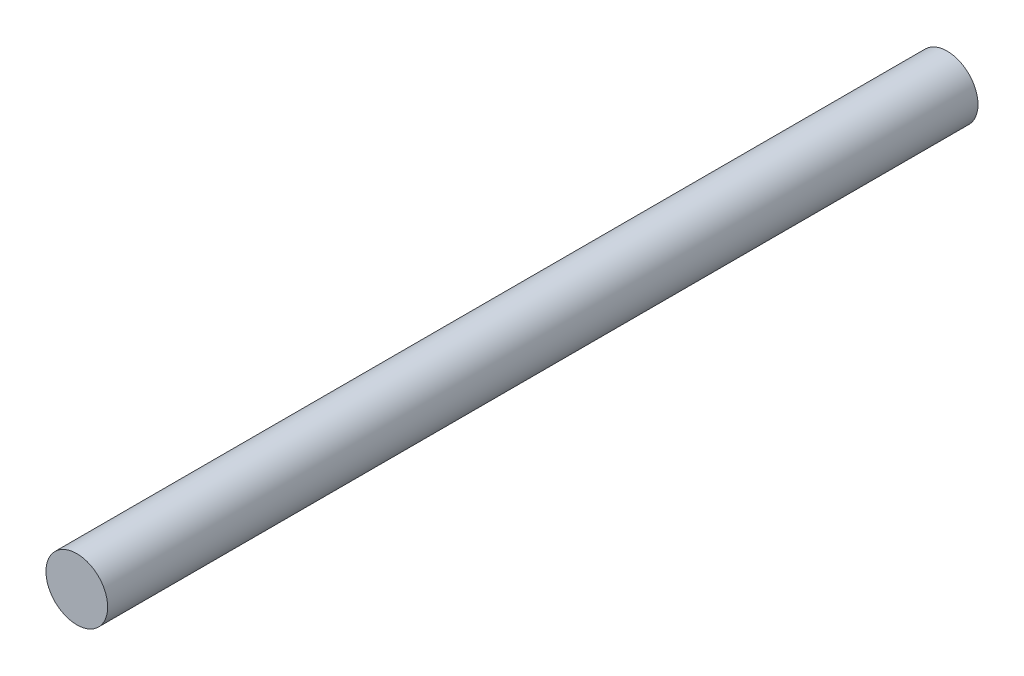
ISO-10303-21;
HEADER;
FILE_DESCRIPTION(('STEP AP214'),'2;1');
FILE_NAME('part.step','',(''),(''),'','','');
FILE_SCHEMA(('AUTOMOTIVE_DESIGN { 1 0 10303 214 1 1 1 1 }'));
ENDSEC;
DATA;
#1=APPLICATION_CONTEXT('core data for automotive mechanical design processes');
#2=APPLICATION_PROTOCOL_DEFINITION('international standard','automotive_design',2000,#1);
#3=PRODUCT_CONTEXT('',#1,'mechanical');
#4=PRODUCT('Part','Part','',(#3));
#5=PRODUCT_RELATED_PRODUCT_CATEGORY('part','',(#4));
#6=PRODUCT_DEFINITION_FORMATION('','',#4);
#7=PRODUCT_DEFINITION_CONTEXT('part definition',#1,'design');
#8=PRODUCT_DEFINITION('design','',#6,#7);
#9=PRODUCT_DEFINITION_SHAPE('','',#8);
#10=(LENGTH_UNIT() NAMED_UNIT(*) SI_UNIT(.MILLI.,.METRE.));
#11=(NAMED_UNIT(*) PLANE_ANGLE_UNIT() SI_UNIT($,.RADIAN.));
#12=(NAMED_UNIT(*) SI_UNIT($,.STERADIAN.) SOLID_ANGLE_UNIT());
#13=UNCERTAINTY_MEASURE_WITH_UNIT(LENGTH_MEASURE(1.E-05),#10,'distance_accuracy_value','');
#14=(GEOMETRIC_REPRESENTATION_CONTEXT(3) GLOBAL_UNCERTAINTY_ASSIGNED_CONTEXT((#13)) GLOBAL_UNIT_ASSIGNED_CONTEXT((#10,
#11,#12)) REPRESENTATION_CONTEXT('',''));
#15=CARTESIAN_POINT('',(0.,0.,0.));
#16=DIRECTION('',(0.,0.,1.));
#17=DIRECTION('',(1.,0.,0.));
#18=AXIS2_PLACEMENT_3D('',#15,#16,#17);
#19=CARTESIAN_POINT('',(0.,0.,28.2));
#20=DIRECTION('',(0.,0.,-1.));
#21=DIRECTION('',(-1.,0.,0.));
#22=AXIS2_PLACEMENT_3D('',#19,#20,#21);
#23=CYLINDRICAL_SURFACE('',#22,1.);
#24=CARTESIAN_POINT('',(0.,0.,28.2));
#25=DIRECTION('',(0.,0.,1.));
#26=DIRECTION('',(1.,0.,0.));
#27=AXIS2_PLACEMENT_3D('',#24,#25,#26);
#28=CIRCLE('',#27,1.);
#29=CARTESIAN_POINT('',(1.,0.,28.2));
#30=VERTEX_POINT('',#29);
#31=EDGE_CURVE('E10',#30,#30,#28,.T.);
#32=ORIENTED_EDGE('',*,*,#31,.F.);
#33=EDGE_LOOP('',(#32));
#34=FACE_BOUND('',#33,.T.);
#35=CARTESIAN_POINT('',(0.,0.,0.));
#36=DIRECTION('',(0.,0.,1.));
#37=DIRECTION('',(1.,0.,0.));
#38=AXIS2_PLACEMENT_3D('',#35,#36,#37);
#39=CIRCLE('',#38,1.);
#40=CARTESIAN_POINT('',(1.,0.,0.));
#41=VERTEX_POINT('',#40);
#42=EDGE_CURVE('E34',#41,#41,#39,.T.);
#43=ORIENTED_EDGE('',*,*,#42,.T.);
#44=EDGE_LOOP('',(#43));
#45=FACE_BOUND('',#44,.T.);
#46=ADVANCED_FACE('F31',(#34,#45),#23,.T.);
#47=CARTESIAN_POINT('',(0.,0.,28.2));
#48=DIRECTION('',(0.,0.,1.));
#49=DIRECTION('',(1.,0.,0.));
#50=AXIS2_PLACEMENT_3D('',#47,#48,#49);
#51=PLANE('',#50);
#52=ORIENTED_EDGE('',*,*,#31,.T.);
#53=EDGE_LOOP('',(#52));
#54=FACE_BOUND('',#53,.T.);
#55=ADVANCED_FACE('F46',(#54),#51,.T.);
#56=CARTESIAN_POINT('',(0.,0.,0.));
#57=DIRECTION('',(0.,0.,1.));
#58=DIRECTION('',(1.,0.,0.));
#59=AXIS2_PLACEMENT_3D('',#56,#57,#58);
#60=PLANE('',#59);
#61=ORIENTED_EDGE('',*,*,#42,.F.);
#62=EDGE_LOOP('',(#61));
#63=FACE_BOUND('',#62,.T.);
#64=ADVANCED_FACE('F44',(#63),#60,.F.);
#65=CLOSED_SHELL('',(#46,#55,#64));
#66=MANIFOLD_SOLID_BREP('B2',#65);
#67=ADVANCED_BREP_SHAPE_REPRESENTATION('',(#18,#66),#14);
#68=SHAPE_DEFINITION_REPRESENTATION(#9,#67);
ENDSEC;
END-ISO-10303-21;
